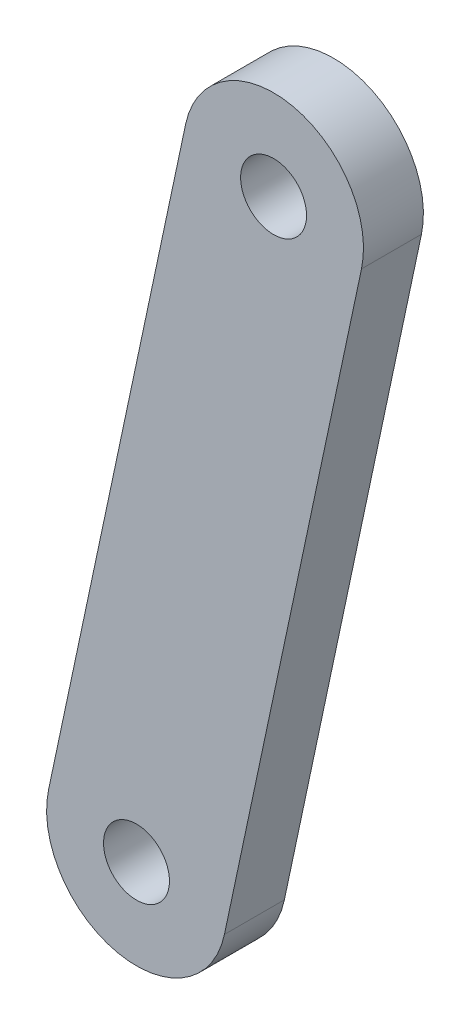
ISO-10303-21;
HEADER;
FILE_DESCRIPTION(('STEP AP214'),'2;1');
FILE_NAME('part.step','',(''),(''),'','','');
FILE_SCHEMA(('AUTOMOTIVE_DESIGN { 1 0 10303 214 1 1 1 1 }'));
ENDSEC;
DATA;
#1=APPLICATION_CONTEXT('core data for automotive mechanical design processes');
#2=APPLICATION_PROTOCOL_DEFINITION('international standard','automotive_design',2000,#1);
#3=PRODUCT_CONTEXT('',#1,'mechanical');
#4=PRODUCT('Part','Part','',(#3));
#5=PRODUCT_RELATED_PRODUCT_CATEGORY('part','',(#4));
#6=PRODUCT_DEFINITION_FORMATION('','',#4);
#7=PRODUCT_DEFINITION_CONTEXT('part definition',#1,'design');
#8=PRODUCT_DEFINITION('design','',#6,#7);
#9=PRODUCT_DEFINITION_SHAPE('','',#8);
#10=(LENGTH_UNIT() NAMED_UNIT(*) SI_UNIT(.MILLI.,.METRE.));
#11=(NAMED_UNIT(*) PLANE_ANGLE_UNIT() SI_UNIT($,.RADIAN.));
#12=(NAMED_UNIT(*) SI_UNIT($,.STERADIAN.) SOLID_ANGLE_UNIT());
#13=UNCERTAINTY_MEASURE_WITH_UNIT(LENGTH_MEASURE(1.E-05),#10,'distance_accuracy_value','');
#14=(GEOMETRIC_REPRESENTATION_CONTEXT(3) GLOBAL_UNCERTAINTY_ASSIGNED_CONTEXT((#13)) GLOBAL_UNIT_ASSIGNED_CONTEXT((#10,
#11,#12)) REPRESENTATION_CONTEXT('',''));
#15=CARTESIAN_POINT('',(0.,0.,0.));
#16=DIRECTION('',(0.,0.,1.));
#17=DIRECTION('',(1.,0.,0.));
#18=AXIS2_PLACEMENT_3D('',#15,#16,#17);
#19=CARTESIAN_POINT('',(12.861085,54.27887,0.));
#20=DIRECTION('',(0.,0.,-1.));
#21=DIRECTION('',(-1.,0.,0.));
#22=AXIS2_PLACEMENT_3D('',#19,#20,#21);
#23=PLANE('',#22);
#24=CARTESIAN_POINT('',(14.51109,54.27887,0.));
#25=CARTESIAN_POINT('',(14.5110921080409,54.3060802353696,0.));
#26=CARTESIAN_POINT('',(14.5104415402772,54.333291840744,0.));
#27=CARTESIAN_POINT('',(14.50782272471,54.3874598152676,0.));
#28=CARTESIAN_POINT('',(14.5058637612656,54.4144166349674,0.));
#29=CARTESIAN_POINT('',(14.5006286539221,54.4680753767878,0.));
#30=CARTESIAN_POINT('',(14.49735870856,54.4947779013919,0.));
#31=CARTESIAN_POINT('',(14.4895054906095,54.5479277493938,0.));
#32=CARTESIAN_POINT('',(14.4849251925286,54.5743755121144,0.));
#33=CARTESIAN_POINT('',(14.47445433338,54.6270161016901,0.));
#34=CARTESIAN_POINT('',(14.4685635000865,54.6532088743968,0.));
#35=CARTESIAN_POINT('',(14.4554750030221,54.7053400584337,0.));
#36=CARTESIAN_POINT('',(14.4482738906566,54.7312776034751,0.));
#37=CARTESIAN_POINT('',(14.4325675341173,54.7828990771646,0.));
#38=CARTESIAN_POINT('',(14.4240558248945,54.8085810371954,0.));
#39=CARTESIAN_POINT('',(14.405732936689,54.859692979166,0.));
#40=CARTESIAN_POINT('',(14.3959125335639,54.8851196500545,0.));
#41=CARTESIAN_POINT('',(14.375091736709,54.9354229762825,0.));
#42=CARTESIAN_POINT('',(14.3640938558593,54.9603006714701,0.));
#43=CARTESIAN_POINT('',(14.3409711918479,55.009319488043,0.));
#44=CARTESIAN_POINT('',(14.328854631398,55.0334644837242,0.));
#45=CARTESIAN_POINT('',(14.3034992337847,55.0810191997632,0.));
#46=CARTESIAN_POINT('',(14.2902656683342,55.1044317298622,0.));
#47=CARTESIAN_POINT('',(14.2626788184445,55.1505225234476,0.));
#48=CARTESIAN_POINT('',(14.2483278857207,55.1732021941578,0.));
#49=CARTESIAN_POINT('',(14.2185093330199,55.2178287549979,0.));
#50=CARTESIAN_POINT('',(14.2030412514771,55.2397753367014,0.));
#51=CARTESIAN_POINT('',(14.1709912902967,55.2829375836223,0.));
#52=CARTESIAN_POINT('',(14.1544063295472,55.3041509603676,0.));
#53=CARTESIAN_POINT('',(14.1201247638895,55.3458484679112,0.));
#54=CARTESIAN_POINT('',(14.1024227224448,55.3663281269145,0.));
#55=CARTESIAN_POINT('',(14.0659109180076,55.4065617584885,0.));
#56=CARTESIAN_POINT('',(14.0470936998334,55.4263089598142,0.));
#57=CARTESIAN_POINT('',(14.0085930508119,55.4648290179611,0.));
#58=CARTESIAN_POINT('',(13.9889122128382,55.4836044658503,0.));
#59=CARTESIAN_POINT('',(13.9487910846413,55.5200434038869,0.));
#60=CARTESIAN_POINT('',(13.9283569099781,55.53771362151,0.));
#61=CARTESIAN_POINT('',(13.8867331440742,55.571945328606,0.));
#62=CARTESIAN_POINT('',(13.8655473477777,55.5885114310956,0.));
#63=CARTESIAN_POINT('',(13.8224222469937,55.620536749831,0.));
#64=CARTESIAN_POINT('',(13.8004845767163,55.6359981661742,0.));
#65=CARTESIAN_POINT('',(13.7558579784911,55.6658166640198,0.));
#66=CARTESIAN_POINT('',(13.7331687421434,55.6801732839416,0.));
#67=CARTESIAN_POINT('',(13.6870409627872,55.7077850118955,0.));
#68=CARTESIAN_POINT('',(13.6636004489599,55.7210368265617,0.));
#69=CARTESIAN_POINT('',(13.6159714666375,55.7464413129641,0.));
#70=CARTESIAN_POINT('',(13.5917796867209,55.7585877728293,0.));
#71=CARTESIAN_POINT('',(13.5426504337225,55.7817863389592,0.));
#72=CARTESIAN_POINT('',(13.5177086641935,55.7928293364341,0.));
#73=CARTESIAN_POINT('',(13.4673977144958,55.8136836692198,0.));
#74=CARTESIAN_POINT('',(13.4420299382711,55.8234983906153,0.));
#75=CARTESIAN_POINT('',(13.3910182712322,55.8418098886083,0.));
#76=CARTESIAN_POINT('',(13.3653774559653,55.8503152209066,0.));
#77=CARTESIAN_POINT('',(13.3138222034126,55.8660124688508,0.));
#78=CARTESIAN_POINT('',(13.2879095068729,55.8732100986306,0.));
#79=CARTESIAN_POINT('',(13.2358115500251,55.8862943735436,0.));
#80=CARTESIAN_POINT('',(13.2096269575893,55.8921836766868,0.));
#81=CARTESIAN_POINT('',(13.1569863117798,55.9026545167529,0.));
#82=CARTESIAN_POINT('',(13.130530150121,55.9072355092114,0.));
#83=CARTESIAN_POINT('',(13.0773470880667,55.9150930825938,0.));
#84=CARTESIAN_POINT('',(13.0506196271886,55.9183658666447,0.));
#85=CARTESIAN_POINT('',(12.9968943092127,55.9236097292304,0.));
#86=CARTESIAN_POINT('',(12.9698957699404,55.9255738015188,0.));
#87=CARTESIAN_POINT('',(12.9156285517352,55.9282055307826,0.));
#88=CARTESIAN_POINT('',(12.8883593891855,55.9288631281545,0.));
#89=CARTESIAN_POINT('',(12.8338975248484,55.9288768524633,0.));
#90=CARTESIAN_POINT('',(12.8067048243377,55.9282366450006,0.));
#91=CARTESIAN_POINT('',(12.7525686823373,55.9256329433726,0.));
#92=CARTESIAN_POINT('',(12.725624808158,55.9236785306052,0.));
#93=CARTESIAN_POINT('',(12.671986888809,55.9184515556941,0.));
#94=CARTESIAN_POINT('',(12.6452922651747,55.9151849388765,0.));
#95=CARTESIAN_POINT('',(12.5921528939236,55.9073362077206,0.));
#96=CARTESIAN_POINT('',(12.565707746164,55.9027568046469,0.));
#97=CARTESIAN_POINT('',(12.5130671139061,55.8922858964519,0.));
#98=CARTESIAN_POINT('',(12.4868717377232,55.8863938468721,0.));
#99=CARTESIAN_POINT('',(12.4347300320629,55.8733010213648,0.));
#100=CARTESIAN_POINT('',(12.4087846377677,55.8660965230965,0.));
#101=CARTESIAN_POINT('',(12.357142176779,55.850381431323,0.));
#102=CARTESIAN_POINT('',(12.331447161013,55.8418641038332,0.));
#103=CARTESIAN_POINT('',(12.2803036696392,55.8235283393077,0.));
#104=CARTESIAN_POINT('',(12.2548585968715,55.8137004233381,0.));
#105=CARTESIAN_POINT('',(12.2045371430426,55.7928714497688,0.));
#106=CARTESIAN_POINT('',(12.1796593603964,55.7818737792309,0.));
#107=CARTESIAN_POINT('',(12.1306404803091,55.7587512679525,0.));
#108=CARTESIAN_POINT('',(12.1064955078144,55.7466346517465,0.));
#109=CARTESIAN_POINT('',(12.0589408086613,55.721279213528,0.));
#110=CARTESIAN_POINT('',(12.0355282723935,55.7080456629117,0.));
#111=CARTESIAN_POINT('',(11.9894374743025,55.6804588238565,0.));
#112=CARTESIAN_POINT('',(11.9667578052396,55.6661078871716,0.));
#113=CARTESIAN_POINT('',(11.9221312456062,55.6362893315691,0.));
#114=CARTESIAN_POINT('',(11.9001846634612,55.620821251088,0.));
#115=CARTESIAN_POINT('',(11.8570224162159,55.5887712906876,0.));
#116=CARTESIAN_POINT('',(11.8358090395893,55.5721863296524,0.));
#117=CARTESIAN_POINT('',(11.7941115321331,55.5379047637843,0.));
#118=CARTESIAN_POINT('',(11.7736318730977,55.5202027224166,0.));
#119=CARTESIAN_POINT('',(11.7333982414998,55.4836909180363,0.));
#120=CARTESIAN_POINT('',(11.7136510401827,55.4648736998411,0.));
#121=CARTESIAN_POINT('',(11.675130982042,55.4263730508042,0.));
#122=CARTESIAN_POINT('',(11.6563555341504,55.4066922128362,0.));
#123=CARTESIAN_POINT('',(11.619916596112,55.3665710846433,0.));
#124=CARTESIAN_POINT('',(11.6022463784895,55.3461369099786,0.));
#125=CARTESIAN_POINT('',(11.5680146713938,55.3045131440735,0.));
#126=CARTESIAN_POINT('',(11.551448568904,55.2833273477774,0.));
#127=CARTESIAN_POINT('',(11.5194232501684,55.2402022469937,0.));
#128=CARTESIAN_POINT('',(11.5039618338253,55.2182645767162,0.));
#129=CARTESIAN_POINT('',(11.4741433359797,55.1736379784909,0.));
#130=CARTESIAN_POINT('',(11.459786716058,55.1509487421432,0.));
#131=CARTESIAN_POINT('',(11.4321749881041,55.104820962787,0.));
#132=CARTESIAN_POINT('',(11.4189231734379,55.0813804489597,0.));
#133=CARTESIAN_POINT('',(11.3935186870356,55.0337514666373,0.));
#134=CARTESIAN_POINT('',(11.3813722271704,55.0095596867208,0.));
#135=CARTESIAN_POINT('',(11.3581736610407,54.9604304337224,0.));
#136=CARTESIAN_POINT('',(11.3471306635659,54.9354886641935,0.));
#137=CARTESIAN_POINT('',(11.3262763307803,54.8851777144959,0.));
#138=CARTESIAN_POINT('',(11.3164616093849,54.8598099382712,0.));
#139=CARTESIAN_POINT('',(11.298150111392,54.8087982712324,0.));
#140=CARTESIAN_POINT('',(11.2896447790938,54.7831574559656,0.));
#141=CARTESIAN_POINT('',(11.2739475311497,54.7316022034129,0.));
#142=CARTESIAN_POINT('',(11.2667499013699,54.7056895068732,0.));
#143=CARTESIAN_POINT('',(11.2536656264569,54.6535915500254,0.));
#144=CARTESIAN_POINT('',(11.2477763233138,54.6274069575897,0.));
#145=CARTESIAN_POINT('',(11.2373054832476,54.5747663117802,0.));
#146=CARTESIAN_POINT('',(11.2327244907891,54.5483101501214,0.));
#147=CARTESIAN_POINT('',(11.2248669174067,54.4951270880671,0.));
#148=CARTESIAN_POINT('',(11.2215941333558,54.4683996271889,0.));
#149=CARTESIAN_POINT('',(11.2163502707699,54.4146743092129,0.));
#150=CARTESIAN_POINT('',(11.2143861984815,54.3876757699406,0.));
#151=CARTESIAN_POINT('',(11.2117544692175,54.3334085517353,0.));
#152=CARTESIAN_POINT('',(11.2110968718456,54.3061393891855,0.));
#153=CARTESIAN_POINT('',(11.2110831475366,54.2516775248486,0.));
#154=CARTESIAN_POINT('',(11.2117233549993,54.224484824338,0.));
#155=CARTESIAN_POINT('',(11.2143270566271,54.1703486823379,0.));
#156=CARTESIAN_POINT('',(11.2162814693945,54.1434048081586,0.));
#157=CARTESIAN_POINT('',(11.2215084443055,54.0897668888098,0.));
#158=CARTESIAN_POINT('',(11.224775061123,54.0630722651756,0.));
#159=CARTESIAN_POINT('',(11.2326237922789,54.0099328939246,0.));
#160=CARTESIAN_POINT('',(11.2372031953525,53.983487746165,0.));
#161=CARTESIAN_POINT('',(11.2476741035475,53.9308471139071,0.));
#162=CARTESIAN_POINT('',(11.2535661531273,53.9046517377242,0.));
#163=CARTESIAN_POINT('',(11.2666589786347,53.8525100320638,0.));
#164=CARTESIAN_POINT('',(11.273863476903,53.8265646377685,0.));
#165=CARTESIAN_POINT('',(11.2895785686766,53.7749221767797,0.));
#166=CARTESIAN_POINT('',(11.2980958961665,53.7492271610135,0.));
#167=CARTESIAN_POINT('',(11.3164316606922,53.6980836696395,0.));
#168=CARTESIAN_POINT('',(11.3262595766618,53.6726385968716,0.));
#169=CARTESIAN_POINT('',(11.3470885502312,53.6223171430425,0.));
#170=CARTESIAN_POINT('',(11.3580862207692,53.5974393603962,0.));
#171=CARTESIAN_POINT('',(11.3812087320477,53.5484204803087,0.));
#172=CARTESIAN_POINT('',(11.3933253482537,53.5242755078139,0.));
#173=CARTESIAN_POINT('',(11.4186807864724,53.4767208086607,0.));
#174=CARTESIAN_POINT('',(11.4319143370886,53.4533082723929,0.));
#175=CARTESIAN_POINT('',(11.4595011761438,53.4072174743019,0.));
#176=CARTESIAN_POINT('',(11.4738521128288,53.384537805239,0.));
#177=CARTESIAN_POINT('',(11.5036706684312,53.3399112456055,0.));
#178=CARTESIAN_POINT('',(11.5191387489123,53.3179646634605,0.));
#179=CARTESIAN_POINT('',(11.5511887093128,53.2748024162153,0.));
#180=CARTESIAN_POINT('',(11.5677736703479,53.2535890395888,0.));
#181=CARTESIAN_POINT('',(11.602055236216,53.2118915321327,0.));
#182=CARTESIAN_POINT('',(11.6197572775836,53.1914118730973,0.));
#183=CARTESIAN_POINT('',(11.6562690819638,53.1511782414996,0.));
#184=CARTESIAN_POINT('',(11.675086300159,53.1314310401826,0.));
#185=CARTESIAN_POINT('',(11.713586949196,53.0929109820418,0.));
#186=CARTESIAN_POINT('',(11.7332677871643,53.07413553415,0.));
#187=CARTESIAN_POINT('',(11.7733889153575,53.0376965961114,0.));
#188=CARTESIAN_POINT('',(11.7938230900224,53.0200263784887,0.));
#189=CARTESIAN_POINT('',(11.8354468559277,52.9857946713928,0.));
#190=CARTESIAN_POINT('',(11.8566326522239,52.969228568903,0.));
#191=CARTESIAN_POINT('',(11.8997577530077,52.9372032501673,0.));
#192=CARTESIAN_POINT('',(11.9216954232852,52.9217418338242,0.));
#193=CARTESIAN_POINT('',(11.9663220215106,52.8919233359786,0.));
#194=CARTESIAN_POINT('',(11.9890112578582,52.8775667160568,0.));
#195=CARTESIAN_POINT('',(12.0351390372142,52.849954988103,0.));
#196=CARTESIAN_POINT('',(12.0585795510415,52.8367031734369,0.));
#197=CARTESIAN_POINT('',(12.1062085333636,52.8112986870349,0.));
#198=CARTESIAN_POINT('',(12.13040031328,52.7991522271698,0.));
#199=CARTESIAN_POINT('',(12.179529566278,52.7759536610403,0.));
#200=CARTESIAN_POINT('',(12.2044713358067,52.7649106635657,0.));
#201=CARTESIAN_POINT('',(12.2547822855045,52.7440563307802,0.));
#202=CARTESIAN_POINT('',(12.2801500617296,52.7342416093847,0.));
#203=CARTESIAN_POINT('',(12.3311617287691,52.7159301113917,0.));
#204=CARTESIAN_POINT('',(12.3568025440362,52.7074247790934,0.));
#205=CARTESIAN_POINT('',(12.4083577965894,52.6917275311492,0.));
#206=CARTESIAN_POINT('',(12.4342704931292,52.6845299013694,0.));
#207=CARTESIAN_POINT('',(12.4863684499772,52.6714456264564,0.));
#208=CARTESIAN_POINT('',(12.512553042413,52.6655563233132,0.));
#209=CARTESIAN_POINT('',(12.5651936882225,52.6550854832471,0.));
#210=CARTESIAN_POINT('',(12.5916498498812,52.6505044907886,0.));
#211=CARTESIAN_POINT('',(12.6448329119353,52.6426469174062,0.));
#212=CARTESIAN_POINT('',(12.6715603728133,52.6393741333553,0.));
#213=CARTESIAN_POINT('',(12.7252856907888,52.6341302707696,0.));
#214=CARTESIAN_POINT('',(12.7522842300608,52.6321661984812,0.));
#215=CARTESIAN_POINT('',(12.8065514482655,52.6295344692174,0.));
#216=CARTESIAN_POINT('',(12.8338206108149,52.6288768718455,0.));
#217=CARTESIAN_POINT('',(12.8882824751516,52.6288631475367,0.));
#218=CARTESIAN_POINT('',(12.9154751756622,52.6295033549994,0.));
#219=CARTESIAN_POINT('',(12.9696113176625,52.6321070566274,0.));
#220=CARTESIAN_POINT('',(12.9965551918419,52.6340614693948,0.));
#221=CARTESIAN_POINT('',(13.0501931111908,52.6392884443059,0.));
#222=CARTESIAN_POINT('',(13.076887734825,52.6425550611235,0.));
#223=CARTESIAN_POINT('',(13.1300271060762,52.6504037922794,0.));
#224=CARTESIAN_POINT('',(13.1564722538358,52.6549831953531,0.));
#225=CARTESIAN_POINT('',(13.2091128860936,52.6654541035481,0.));
#226=CARTESIAN_POINT('',(13.2353082622766,52.6713461531278,0.));
#227=CARTESIAN_POINT('',(13.2874499679368,52.6844389786352,0.));
#228=CARTESIAN_POINT('',(13.3133953622321,52.6916434769035,0.));
#229=CARTESIAN_POINT('',(13.3650378232208,52.707358568677,0.));
#230=CARTESIAN_POINT('',(13.3907328389869,52.7158758961668,0.));
#231=CARTESIAN_POINT('',(13.4418763303607,52.7342116606923,0.));
#232=CARTESIAN_POINT('',(13.4673214031285,52.7440395766619,0.));
#233=CARTESIAN_POINT('',(13.5176428569574,52.7648685502312,0.));
#234=CARTESIAN_POINT('',(13.5425206396036,52.7758662207691,0.));
#235=CARTESIAN_POINT('',(13.5915395196908,52.7989887320474,0.));
#236=CARTESIAN_POINT('',(13.6156844921855,52.8111053482533,0.));
#237=CARTESIAN_POINT('',(13.6632391913386,52.8364607864719,0.));
#238=CARTESIAN_POINT('',(13.6866517276064,52.8496943370881,0.));
#239=CARTESIAN_POINT('',(13.7327425256973,52.8772811761433,0.));
#240=CARTESIAN_POINT('',(13.7554221947602,52.8916321128282,0.));
#241=CARTESIAN_POINT('',(13.8000487543937,52.9214506684307,0.));
#242=CARTESIAN_POINT('',(13.8219953365388,52.9369187489117,0.));
#243=CARTESIAN_POINT('',(13.8651575837838,52.9689687093123,0.));
#244=CARTESIAN_POINT('',(13.88637096041,52.9855536703476,0.));
#245=CARTESIAN_POINT('',(13.9280684678673,53.0198352362154,0.));
#246=CARTESIAN_POINT('',(13.9485481269043,53.0375372775824,0.));
#247=CARTESIAN_POINT('',(13.9887817584981,53.0740490819645,0.));
#248=CARTESIAN_POINT('',(14.0085289598096,53.0928663001621,0.));
#249=CARTESIAN_POINT('',(14.0470490179656,53.1313669491925,0.));
#250=CARTESIAN_POINT('',(14.0658244658782,53.1510477871518,0.));
#251=CARTESIAN_POINT('',(14.1022634038594,53.1911689153684,0.));
#252=CARTESIAN_POINT('',(14.1199336214045,53.2116030900654,0.));
#253=CARTESIAN_POINT('',(14.1541653287113,53.2532268558823,0.));
#254=CARTESIAN_POINT('',(14.170731431488,53.2744126520588,0.));
#255=CARTESIAN_POINT('',(14.2027567494398,53.3175377531693,0.));
#256=CARTESIAN_POINT('',(14.2182181647149,53.339475423892,0.));
#257=CARTESIAN_POINT('',(14.24803666548,53.3841020209001,0.));
#258=CARTESIAN_POINT('',(14.2623932893913,53.4067912555845,0.));
#259=CARTESIAN_POINT('',(14.2900050064304,53.4529190394913,0.));
#260=CARTESIAN_POINT('',(14.3032568061378,53.4763595595553,0.));
#261=CARTESIAN_POINT('',(14.3286613334968,53.523988524802,0.));
#262=CARTESIAN_POINT('',(14.3408078496544,53.548180281249,0.));
#263=CARTESIAN_POINT('',(14.364006261545,53.5973095985532,0.));
#264=CARTESIAN_POINT('',(14.3750490464383,53.6222514567123,0.));
#265=CARTESIAN_POINT('',(14.3959115827416,53.6725805580231,0.));
#266=CARTESIAN_POINT('',(14.4057338425005,53.697966761164,0.));
#267=CARTESIAN_POINT('',(14.424058259203,53.7490100221604,0.));
#268=CARTESIAN_POINT('',(14.4325692292494,53.774663911622,0.));
#269=CARTESIAN_POINT('',(14.4482752374513,53.8262401796634,0.));
#270=CARTESIAN_POINT('',(14.4554762598627,53.8521607348492,0.));
#271=CARTESIAN_POINT('',(14.4685648884679,53.9042692326708,0.));
#272=CARTESIAN_POINT('',(14.4744554271134,53.9304564383455,0.));
#273=CARTESIAN_POINT('',(14.4849262739472,53.9830971105401,0.));
#274=CARTESIAN_POINT('',(14.4895063098834,54.0095506312061,0.));
#275=CARTESIAN_POINT('',(14.4973595407412,54.0627232634904,0.));
#276=CARTESIAN_POINT('',(14.5006292018539,54.0894428967605,0.));
#277=CARTESIAN_POINT('',(14.5058643113064,54.143147132093,0.));
#278=CARTESIAN_POINT('',(14.5078230005145,54.1701323903829,0.));
#279=CARTESIAN_POINT('',(14.5104418043506,54.2243686004085,0.));
#280=CARTESIAN_POINT('',(14.5110920872257,54.2516200287767,0.));
#281=CARTESIAN_POINT('',(14.51109,54.27887,0.));
#282=B_SPLINE_CURVE_WITH_KNOTS('',3,(#24,#25,#26,#27,#28,#29,#30,#31,#32,#33,#34,#35,#36,#37,
#38,#39,#40,#41,#42,#43,#44,#45,#46,#47,#48,#49,#50,#51,#52,#53,#54,#55,#56,#57,#58,#59,#60,#61,
#62,#63,#64,#65,#66,#67,#68,#69,#70,#71,#72,#73,#74,#75,#76,#77,#78,#79,#80,#81,#82,#83,#84,#85,
#86,#87,#88,#89,#90,#91,#92,#93,#94,#95,#96,#97,#98,#99,#100,#101,#102,#103,#104,#105,#106,#107,
#108,#109,#110,#111,#112,#113,#114,#115,#116,#117,#118,#119,#120,#121,#122,#123,#124,#125,#126,
#127,#128,#129,#130,#131,#132,#133,#134,#135,#136,#137,#138,#139,#140,#141,#142,#143,#144,#145,
#146,#147,#148,#149,#150,#151,#152,#153,#154,#155,#156,#157,#158,#159,#160,#161,#162,#163,#164,
#165,#166,#167,#168,#169,#170,#171,#172,#173,#174,#175,#176,#177,#178,#179,#180,#181,#182,#183,
#184,#185,#186,#187,#188,#189,#190,#191,#192,#193,#194,#195,#196,#197,#198,#199,#200,#201,#202,
#203,#204,#205,#206,#207,#208,#209,#210,#211,#212,#213,#214,#215,#216,#217,#218,#219,#220,#221,
#222,#223,#224,#225,#226,#227,#228,#229,#230,#231,#232,#233,#234,#235,#236,#237,#238,#239,#240,
#241,#242,#243,#244,#245,#246,#247,#248,#249,#250,#251,#252,#253,#254,#255,#256,#257,#258,#259,
#260,#261,#262,#263,#264,#265,#266,#267,#268,#269,#270,#271,#272,#273,#274,#275,#276,#277,#278,
#279,#280,#281),.UNSPECIFIED.,.F.,.F.,(4,2,2,2,2,2,2,2,2,2,2,2,2,2,2,2,2,2,2,2,2,2,2,2,2,2,2,2,
2,2,2,2,2,2,2,2,2,2,2,2,2,2,2,2,2,2,2,2,2,2,2,2,2,2,2,2,2,2,2,2,2,2,2,2,2,2,2,2,2,2,2,2,2,2,2,2,
2,2,2,2,2,2,2,2,2,2,2,2,2,2,2,2,2,2,2,2,2,2,2,2,2,2,2,2,2,2,2,2,2,2,2,2,2,2,2,2,2,2,2,2,2,2,2,2,
2,2,2,2,4),(0.,0.0816248451824052,0.162676549521562,0.243349464346557,0.32384068486957,
0.404348640756264,0.485071638258024,0.56620640685405,0.647946702971925,0.729515907281233,
0.810527168171509,0.891175450631839,0.971658357574624,1.0521747095133,1.13292307991453,
1.21410033959228,1.29590026274941,1.37746946705828,1.45848072794824,1.53912901040839,
1.61961191735112,1.70012826928985,1.78087663969125,1.86205389936927,1.94385382252676,
2.02542302683584,2.10643428772594,2.18708257018617,2.26756547712892,2.34808182906763,
2.42883019946898,2.51000745914691,2.59180738230431,2.67337658661362,2.75438784750391,
2.83503612996425,2.91551903690704,2.99603538884571,3.07678375924692,3.15796101892462,
3.23976094208167,3.32133014639065,3.40234140728068,3.48298968974087,3.56347259668361,
3.64398894862233,3.72473731902371,3.80591457870169,3.88771450185915,3.96928370616821,
4.05029496705831,4.13094324951854,4.2114261564613,4.2919425084,4.37269087880133,
4.45386813847923,4.53566806163656,4.6172372659454,4.69824852683534,4.77889680929546,
4.85937971623819,4.93989606817693,5.02064443857836,5.10182169825643,5.183621621414,
5.26519082572284,5.3462020866128,5.42685036907293,5.50733327601566,5.58784962795439,
5.66859799835582,5.74977525803388,5.83157518119144,5.91314438550075,5.99415564639102,
6.07480392885135,6.15528683579414,6.23580318773281,6.31655155813405,6.3977288178118,
6.47952874096893,6.56109794527882,6.64210920616951,6.72275748863009,6.80324039557297,
6.88375674751156,6.96450511791253,7.04568237758985,7.12748230074638,7.20905150505642,
7.29006276594723,7.37071104840788,7.45119395535077,7.53171030728934,7.61245867769025,
7.69363593736745,7.77543586052382,7.85700506483302,7.93801632572322,8.01866460818351,
8.09914751512628,8.17966386706497,8.26041223746623,8.341589497144,8.42338942030116,
8.50495862461004,8.58596988549999,8.66661816796013,8.74710107490285,8.8276174268416,
8.90836579724302,8.98954305692108,9.07134298007866,9.15291218438754,9.2339234452775,
9.31457172773765,9.39505463468038,9.47557098661911,9.55631935702052,9.63749661669854,
9.71929653985605,9.80092547025816,9.88197929188238,9.96265298789664,10.0431443039793,
10.1236523297175,10.2043760310647,10.2855127873319,10.3672569858007),.UNSPECIFIED.);
#283=CARTESIAN_POINT('',(14.51109,54.27887,0.));
#284=VERTEX_POINT('',#283);
#285=EDGE_CURVE('E124',#284,#284,#282,.T.);
#286=ORIENTED_EDGE('',*,*,#285,.T.);
#287=EDGE_LOOP('',(#286));
#288=FACE_BOUND('',#287,.T.);
#289=CARTESIAN_POINT('',(12.861085,54.27887,0.));
#290=DIRECTION('',(0.,0.,1.));
#291=DIRECTION('',(-1.,0.,0.));
#292=AXIS2_PLACEMENT_3D('',#289,#290,#291);
#293=CIRCLE('',#292,4.50000023691388);
#294=CARTESIAN_POINT('',(17.26275,53.34327,0.));
#295=VERTEX_POINT('',#294);
#296=CARTESIAN_POINT('',(8.45942,55.21447,0.));
#297=VERTEX_POINT('',#296);
#298=EDGE_CURVE('E115',#295,#297,#293,.T.);
#299=ORIENTED_EDGE('',*,*,#298,.F.);
#300=DIRECTION('',(0.207911817755589,0.978147573752328,0.));
#301=VECTOR('',#300,1.);
#302=CARTESIAN_POINT('',(17.26275,53.34327,0.));
#303=LINE('',#302,#301);
#304=CARTESIAN_POINT('',(10.40166,21.0644,0.));
#305=VERTEX_POINT('',#304);
#306=EDGE_CURVE('E87',#305,#295,#303,.T.);
#307=ORIENTED_EDGE('',*,*,#306,.F.);
#308=CARTESIAN_POINT('',(6.,22.,0.));
#309=DIRECTION('',(0.,0.,1.));
#310=DIRECTION('',(-1.,0.,0.));
#311=AXIS2_PLACEMENT_3D('',#308,#309,#310);
#312=CIRCLE('',#311,4.49999534617537);
#313=CARTESIAN_POINT('',(1.59834,22.9356,0.));
#314=VERTEX_POINT('',#313);
#315=EDGE_CURVE('E83',#314,#305,#312,.T.);
#316=ORIENTED_EDGE('',*,*,#315,.F.);
#317=DIRECTION('',(-0.207911527824449,-0.978147635379089,0.));
#318=VECTOR('',#317,1.);
#319=CARTESIAN_POINT('',(1.59834,22.9356,0.));
#320=LINE('',#319,#318);
#321=EDGE_CURVE('E103',#297,#314,#320,.T.);
#322=ORIENTED_EDGE('',*,*,#321,.F.);
#323=EDGE_LOOP('',(#299,#307,#316,#322));
#324=FACE_BOUND('',#323,.T.);
#325=CARTESIAN_POINT('',(7.65,22.,0.));
#326=CARTESIAN_POINT('',(7.65000210804085,22.0272102353696,0.));
#327=CARTESIAN_POINT('',(7.64935154027722,22.0544218407441,0.));
#328=CARTESIAN_POINT('',(7.64673272470997,22.1085898152678,0.));
#329=CARTESIAN_POINT('',(7.64477376126562,22.1355466349676,0.));
#330=CARTESIAN_POINT('',(7.63953865392211,22.189205376788,0.));
#331=CARTESIAN_POINT('',(7.63626870856,22.2159079013922,0.));
#332=CARTESIAN_POINT('',(7.62841549060945,22.2690577493941,0.));
#333=CARTESIAN_POINT('',(7.62383519252857,22.2955055121147,0.));
#334=CARTESIAN_POINT('',(7.61336433338,22.3481461016904,0.));
#335=CARTESIAN_POINT('',(7.60747350008648,22.3743388743971,0.));
#336=CARTESIAN_POINT('',(7.59438500302211,22.4264700584339,0.));
#337=CARTESIAN_POINT('',(7.58718389065662,22.4524076034754,0.));
#338=CARTESIAN_POINT('',(7.57147753411732,22.5040290771648,0.));
#339=CARTESIAN_POINT('',(7.56296582489454,22.5297110371956,0.));
#340=CARTESIAN_POINT('',(7.54464293668901,22.5808229791661,0.));
#341=CARTESIAN_POINT('',(7.53482253356388,22.6062496500546,0.));
#342=CARTESIAN_POINT('',(7.51400173670909,22.6565529762823,0.));
#343=CARTESIAN_POINT('',(7.50300385585948,22.6814306714696,0.));
#344=CARTESIAN_POINT('',(7.4798811918482,22.7304494880421,0.));
#345=CARTESIAN_POINT('',(7.46776463139838,22.7545944837231,0.));
#346=CARTESIAN_POINT('',(7.44240923378515,22.8021491997619,0.));
#347=CARTESIAN_POINT('',(7.42917566833465,22.8255617298608,0.));
#348=CARTESIAN_POINT('',(7.40158881844497,22.8716525234461,0.));
#349=CARTESIAN_POINT('',(7.38723788572124,22.8943321941562,0.));
#350=CARTESIAN_POINT('',(7.35741933302038,22.9389587549963,0.));
#351=CARTESIAN_POINT('',(7.34195125147757,22.9609053366998,0.));
#352=CARTESIAN_POINT('',(7.30990129029715,23.0040675836209,0.));
#353=CARTESIAN_POINT('',(7.29331632954764,23.0252809603663,0.));
#354=CARTESIAN_POINT('',(7.25903476388987,23.0669784679101,0.));
#355=CARTESIAN_POINT('',(7.24133272244506,23.0874581269136,0.));
#356=CARTESIAN_POINT('',(7.20482091800776,23.127691758488,0.));
#357=CARTESIAN_POINT('',(7.18600369983347,23.147438959814,0.));
#358=CARTESIAN_POINT('',(7.14750305081201,23.1859590179611,0.));
#359=CARTESIAN_POINT('',(7.12782221283856,23.2047344658504,0.));
#360=CARTESIAN_POINT('',(7.08770108464191,23.2411734038869,0.));
#361=CARTESIAN_POINT('',(7.06726690997881,23.2588436215101,0.));
#362=CARTESIAN_POINT('',(7.02564314407505,23.2930753286061,0.));
#363=CARTESIAN_POINT('',(7.00445734777857,23.3096414310957,0.));
#364=CARTESIAN_POINT('',(6.9613322469947,23.3416667498311,0.));
#365=CARTESIAN_POINT('',(6.93939457671735,23.3571281661743,0.));
#366=CARTESIAN_POINT('',(6.8947679784921,23.3869466640199,0.));
#367=CARTESIAN_POINT('',(6.87207874214437,23.4013032839417,0.));
#368=CARTESIAN_POINT('',(6.82595096278808,23.4289150118956,0.));
#369=CARTESIAN_POINT('',(6.80251044896069,23.4421668265618,0.));
#370=CARTESIAN_POINT('',(6.75488146663811,23.4675713129641,0.));
#371=CARTESIAN_POINT('',(6.73068968672142,23.4797177728293,0.));
#372=CARTESIAN_POINT('',(6.68156043372278,23.5029163389592,0.));
#373=CARTESIAN_POINT('',(6.65661866419365,23.5139593364341,0.));
#374=CARTESIAN_POINT('',(6.60630771449582,23.5348136692197,0.));
#375=CARTESIAN_POINT('',(6.58093993827115,23.5446283906151,0.));
#376=CARTESIAN_POINT('',(6.5299282712323,23.562939888608,0.));
#377=CARTESIAN_POINT('',(6.50428745596541,23.5714452209062,0.));
#378=CARTESIAN_POINT('',(6.45273220341266,23.5871424688503,0.));
#379=CARTESIAN_POINT('',(6.42681950687301,23.5943400986301,0.));
#380=CARTESIAN_POINT('',(6.37472155002518,23.6074243735431,0.));
#381=CARTESIAN_POINT('',(6.34853695758943,23.6133136766862,0.));
#382=CARTESIAN_POINT('',(6.29589631177992,23.6237845167524,0.));
#383=CARTESIAN_POINT('',(6.26944015012116,23.6283655092109,0.));
#384=CARTESIAN_POINT('',(6.21625708806686,23.6362230825933,0.));
#385=CARTESIAN_POINT('',(6.18952962718871,23.6394958666442,0.));
#386=CARTESIAN_POINT('',(6.13580430921278,23.64473972923,0.));
#387=CARTESIAN_POINT('',(6.10880576994051,23.6467038015185,0.));
#388=CARTESIAN_POINT('',(6.05453855173522,23.6493355307825,0.));
#389=CARTESIAN_POINT('',(6.0272693891855,23.6499931281544,0.));
#390=CARTESIAN_POINT('',(5.97280752484861,23.6500068524634,0.));
#391=CARTESIAN_POINT('',(5.94561482433811,23.6493666450007,0.));
#392=CARTESIAN_POINT('',(5.89147868233813,23.6467629433729,0.));
#393=CARTESIAN_POINT('',(5.8645348081589,23.6448085306055,0.));
#394=CARTESIAN_POINT('',(5.81089688881014,23.6395815556945,0.));
#395=CARTESIAN_POINT('',(5.784202265176,23.636314938877,0.));
#396=CARTESIAN_POINT('',(5.73106289392498,23.6284662077211,0.));
#397=CARTESIAN_POINT('',(5.70461774616539,23.6238868046475,0.));
#398=CARTESIAN_POINT('',(5.65197711390755,23.6134158964525,0.));
#399=CARTESIAN_POINT('',(5.62578173772455,23.6075238468727,0.));
#400=CARTESIAN_POINT('',(5.57364003206418,23.5944310213653,0.));
#401=CARTESIAN_POINT('',(5.54769463776884,23.587226523097,0.));
#402=CARTESIAN_POINT('',(5.49605217677992,23.5715114313234,0.));
#403=CARTESIAN_POINT('',(5.47035716101376,23.5629941038335,0.));
#404=CARTESIAN_POINT('',(5.41921366963962,23.5446583393078,0.));
#405=CARTESIAN_POINT('',(5.39376859687171,23.5348304233382,0.));
#406=CARTESIAN_POINT('',(5.34344714304276,23.5140014497689,0.));
#407=CARTESIAN_POINT('',(5.31856936039667,23.503003779231,0.));
#408=CARTESIAN_POINT('',(5.26955048030964,23.4798812679528,0.));
#409=CARTESIAN_POINT('',(5.24540550781502,23.4677646517468,0.));
#410=CARTESIAN_POINT('',(5.19785080866209,23.4424092135283,0.));
#411=CARTESIAN_POINT('',(5.17443827239438,23.4291756629121,0.));
#412=CARTESIAN_POINT('',(5.12834747430351,23.401588823857,0.));
#413=CARTESIAN_POINT('',(5.10566780524062,23.3872378871721,0.));
#414=CARTESIAN_POINT('',(5.06104124560718,23.3574193315696,0.));
#415=CARTESIAN_POINT('',(5.03909466346214,23.3419512510885,0.));
#416=CARTESIAN_POINT('',(4.99593241621678,23.309901290688,0.));
#417=CARTESIAN_POINT('',(4.97471903959015,23.2933163296528,0.));
#418=CARTESIAN_POINT('',(4.93302153213377,23.2590347637846,0.));
#419=CARTESIAN_POINT('',(4.91254187309824,23.2413327224169,0.));
#420=CARTESIAN_POINT('',(4.87230824150012,23.2048209180364,0.));
#421=CARTESIAN_POINT('',(4.85256104018282,23.1860036998412,0.));
#422=CARTESIAN_POINT('',(4.81404098204208,23.1475030508043,0.));
#423=CARTESIAN_POINT('',(4.79526553415049,23.1278222128364,0.));
#424=CARTESIAN_POINT('',(4.75882659611224,23.0877010846438,0.));
#425=CARTESIAN_POINT('',(4.74115637848971,23.0672669099792,0.));
#426=CARTESIAN_POINT('',(4.70692467139412,23.0256431440743,0.));
#427=CARTESIAN_POINT('',(4.69035856890437,23.0044573477782,0.));
#428=CARTESIAN_POINT('',(4.65833325016881,22.9613322469946,0.));
#429=CARTESIAN_POINT('',(4.6428718338257,22.9393945767171,0.));
#430=CARTESIAN_POINT('',(4.6130533359801,22.8947679784918,0.));
#431=CARTESIAN_POINT('',(4.59869671605834,22.8720787421441,0.));
#432=CARTESIAN_POINT('',(4.57108498810441,22.8259509627878,0.));
#433=CARTESIAN_POINT('',(4.5578331734382,22.8025104489605,0.));
#434=CARTESIAN_POINT('',(4.53242868703588,22.7548814666379,0.));
#435=CARTESIAN_POINT('',(4.52028222717064,22.7306896867213,0.));
#436=CARTESIAN_POINT('',(4.49708366104077,22.6815604337227,0.));
#437=CARTESIAN_POINT('',(4.48604066356591,22.6566186641936,0.));
#438=CARTESIAN_POINT('',(4.46518633078027,22.6063077144959,0.));
#439=CARTESIAN_POINT('',(4.45537160938489,22.5809399382712,0.));
#440=CARTESIAN_POINT('',(4.43706011139203,22.5299282712324,0.));
#441=CARTESIAN_POINT('',(4.42855477909377,22.5042874559656,0.));
#442=CARTESIAN_POINT('',(4.41285753114967,22.4527322034129,0.));
#443=CARTESIAN_POINT('',(4.40565990136989,22.4268195068732,0.));
#444=CARTESIAN_POINT('',(4.39257562645692,22.3747215500254,0.));
#445=CARTESIAN_POINT('',(4.38668632331376,22.3485369575897,0.));
#446=CARTESIAN_POINT('',(4.37621548324761,22.2958963117802,0.));
#447=CARTESIAN_POINT('',(4.37163449078914,22.2694401501214,0.));
#448=CARTESIAN_POINT('',(4.36377691740666,22.2162570880671,0.));
#449=CARTESIAN_POINT('',(4.36050413335578,22.1895296271889,0.));
#450=CARTESIAN_POINT('',(4.35526027076995,22.1358043092129,0.));
#451=CARTESIAN_POINT('',(4.35329619848152,22.1088057699406,0.));
#452=CARTESIAN_POINT('',(4.35066446921754,22.0545385517353,0.));
#453=CARTESIAN_POINT('',(4.35000687184559,22.0272693891855,0.));
#454=CARTESIAN_POINT('',(4.34999314753663,21.9728075248486,0.));
#455=CARTESIAN_POINT('',(4.35063335499925,21.945614824338,0.));
#456=CARTESIAN_POINT('',(4.35323705662709,21.8914786823379,0.));
#457=CARTESIAN_POINT('',(4.35519146939448,21.8645348081586,0.));
#458=CARTESIAN_POINT('',(4.36041844430549,21.8108968888098,0.));
#459=CARTESIAN_POINT('',(4.36368506112298,21.7842022651756,0.));
#460=CARTESIAN_POINT('',(4.37153379227886,21.7310628939246,0.));
#461=CARTESIAN_POINT('',(4.37611319535253,21.704617746165,0.));
#462=CARTESIAN_POINT('',(4.38658410354752,21.6519771139071,0.));
#463=CARTESIAN_POINT('',(4.39247615312733,21.6257817377242,0.));
#464=CARTESIAN_POINT('',(4.40556897863468,21.5736400320638,0.));
#465=CARTESIAN_POINT('',(4.41277347690301,21.5476946377685,0.));
#466=CARTESIAN_POINT('',(4.42848856867661,21.4960521767797,0.));
#467=CARTESIAN_POINT('',(4.43700589616652,21.4703571610135,0.));
#468=CARTESIAN_POINT('',(4.45534166069215,21.4192136696395,0.));
#469=CARTESIAN_POINT('',(4.46516957666184,21.3937685968716,0.));
#470=CARTESIAN_POINT('',(4.48599855023114,21.3434471430428,0.));
#471=CARTESIAN_POINT('',(4.49699622076902,21.3185693603967,0.));
#472=CARTESIAN_POINT('',(4.52011873204725,21.2695504803097,0.));
#473=CARTESIAN_POINT('',(4.53223534825322,21.2454055078151,0.));
#474=CARTESIAN_POINT('',(4.55759078647173,21.1978508086622,0.));
#475=CARTESIAN_POINT('',(4.57082433708796,21.1744382723945,0.));
#476=CARTESIAN_POINT('',(4.59841117614311,21.1283474743037,0.));
#477=CARTESIAN_POINT('',(4.61276211282804,21.1056678052408,0.));
#478=CARTESIAN_POINT('',(4.64258066843049,21.0610412456074,0.));
#479=CARTESIAN_POINT('',(4.65804874891162,21.0390946634623,0.));
#480=CARTESIAN_POINT('',(4.69009870931211,20.9959324162169,0.));
#481=CARTESIAN_POINT('',(4.70668367034724,20.9747190395903,0.));
#482=CARTESIAN_POINT('',(4.74096523621546,20.9330215321339,0.));
#483=CARTESIAN_POINT('',(4.75866727758318,20.9125418730983,0.));
#484=CARTESIAN_POINT('',(4.79517908196359,20.8723082415002,0.));
#485=CARTESIAN_POINT('',(4.81399630015885,20.8525610401828,0.));
#486=CARTESIAN_POINT('',(4.85249694919547,20.8140409820422,0.));
#487=CARTESIAN_POINT('',(4.87217778716318,20.7952655341508,0.));
#488=CARTESIAN_POINT('',(4.91229891535551,20.7588265961128,0.));
#489=CARTESIAN_POINT('',(4.93273309001999,20.7411563784904,0.));
#490=CARTESIAN_POINT('',(4.97435685592467,20.706924671395,0.));
#491=CARTESIAN_POINT('',(4.99554265222068,20.6903585689053,0.));
#492=CARTESIAN_POINT('',(5.03866775300418,20.6583332501698,0.));
#493=CARTESIAN_POINT('',(5.06060542328162,20.6428718338267,0.));
#494=CARTESIAN_POINT('',(5.10523202150694,20.6130533359811,0.));
#495=CARTESIAN_POINT('',(5.12792125785467,20.5986967160593,0.));
#496=CARTESIAN_POINT('',(5.17404903721102,20.5710849881053,0.));
#497=CARTESIAN_POINT('',(5.19748955103848,20.5578331734391,0.));
#498=CARTESIAN_POINT('',(5.24511853336124,20.5324286870365,0.));
#499=CARTESIAN_POINT('',(5.26931031327804,20.5202822271712,0.));
#500=CARTESIAN_POINT('',(5.31843956627692,20.4970836610411,0.));
#501=CARTESIAN_POINT('',(5.3433813358062,20.4860406635661,0.));
#502=CARTESIAN_POINT('',(5.39369228550416,20.4651863307802,0.));
#503=CARTESIAN_POINT('',(5.41906006172881,20.4553716093847,0.));
#504=CARTESIAN_POINT('',(5.47007172876762,20.4370601113917,0.));
#505=CARTESIAN_POINT('',(5.4957125440345,20.4285547790934,0.));
#506=CARTESIAN_POINT('',(5.54726779658722,20.4128575311492,0.));
#507=CARTESIAN_POINT('',(5.57318049312687,20.4056599013694,0.));
#508=CARTESIAN_POINT('',(5.62527844997469,20.3925756264564,0.));
#509=CARTESIAN_POINT('',(5.65146304241043,20.3866863233132,0.));
#510=CARTESIAN_POINT('',(5.70410368821994,20.3762154832471,0.));
#511=CARTESIAN_POINT('',(5.7305598498787,20.3716344907886,0.));
#512=CARTESIAN_POINT('',(5.78374291193302,20.3637769174062,0.));
#513=CARTESIAN_POINT('',(5.81047037281118,20.3605041333553,0.));
#514=CARTESIAN_POINT('',(5.86419569078714,20.3552602707696,0.));
#515=CARTESIAN_POINT('',(5.89119423005941,20.3532961984812,0.));
#516=CARTESIAN_POINT('',(5.94546144826474,20.3506644692174,0.));
#517=CARTESIAN_POINT('',(5.97273061081448,20.3500068718455,0.));
#518=CARTESIAN_POINT('',(6.02719247515122,20.3499931475367,0.));
#519=CARTESIAN_POINT('',(6.05438517566155,20.3506333549994,0.));
#520=CARTESIAN_POINT('',(6.10852131766124,20.3532370566274,0.));
#521=CARTESIAN_POINT('',(6.13546519184034,20.3551914693948,0.));
#522=CARTESIAN_POINT('',(6.18910311118891,20.3604184443059,0.));
#523=CARTESIAN_POINT('',(6.21579773482297,20.3636850611235,0.));
#524=CARTESIAN_POINT('',(6.2689371060739,20.3715337922794,0.));
#525=CARTESIAN_POINT('',(6.29538225383346,20.3761131953531,0.));
#526=CARTESIAN_POINT('',(6.3480228860913,20.3865841035481,0.));
#527=CARTESIAN_POINT('',(6.37421826227432,20.3924761531279,0.));
#528=CARTESIAN_POINT('',(6.42635996793478,20.4055689786352,0.));
#529=CARTESIAN_POINT('',(6.4523053622302,20.4127734769035,0.));
#530=CARTESIAN_POINT('',(6.50394782321931,20.428488568677,0.));
#531=CARTESIAN_POINT('',(6.52964283898559,20.4370058961668,0.));
#532=CARTESIAN_POINT('',(6.58078633036003,20.4553416606923,0.));
#533=CARTESIAN_POINT('',(6.60623140312811,20.4651695766619,0.));
#534=CARTESIAN_POINT('',(6.65655285695715,20.4859985502309,0.));
#535=CARTESIAN_POINT('',(6.68143063960316,20.4969962207686,0.));
#536=CARTESIAN_POINT('',(6.73044951969004,20.5201187320465,0.));
#537=CARTESIAN_POINT('',(6.7545944921846,20.5322353482523,0.));
#538=CARTESIAN_POINT('',(6.80214919133743,20.5575907864706,0.));
#539=CARTESIAN_POINT('',(6.82556172760511,20.5708243370867,0.));
#540=CARTESIAN_POINT('',(6.87165252569591,20.5984111761418,0.));
#541=CARTESIAN_POINT('',(6.89433219475877,20.6127621128267,0.));
#542=CARTESIAN_POINT('',(6.93895875439228,20.6425806684291,0.));
#543=CARTESIAN_POINT('',(6.96090533653744,20.6580487489102,0.));
#544=CARTESIAN_POINT('',(7.00406758378256,20.690098709311,0.));
#545=CARTESIAN_POINT('',(7.02528096040883,20.7066836703463,0.));
#546=CARTESIAN_POINT('',(7.0669784678664,20.7409652362143,0.));
#547=CARTESIAN_POINT('',(7.08745812690348,20.7586672775816,0.));
#548=CARTESIAN_POINT('',(7.12769175849765,20.795179081964,0.));
#549=CARTESIAN_POINT('',(7.14743895980939,20.8139963001619,0.));
#550=CARTESIAN_POINT('',(7.18595901796571,20.8524969491927,0.));
#551=CARTESIAN_POINT('',(7.20473446587836,20.872177787152,0.));
#552=CARTESIAN_POINT('',(7.24117340385969,20.9122989153688,0.));
#553=CARTESIAN_POINT('',(7.25884362140491,20.9327330900659,0.));
#554=CARTESIAN_POINT('',(7.29307532871182,20.9743568558829,0.));
#555=CARTESIAN_POINT('',(7.30964143148854,20.9955426520595,0.));
#556=CARTESIAN_POINT('',(7.34166674944038,21.03866775317,0.));
#557=CARTESIAN_POINT('',(7.35712816471555,21.0606054238927,0.));
#558=CARTESIAN_POINT('',(7.38694666548064,21.1052320209009,0.));
#559=CARTESIAN_POINT('',(7.40130328939191,21.1279212555852,0.));
#560=CARTESIAN_POINT('',(7.42891500643094,21.174049039492,0.));
#561=CARTESIAN_POINT('',(7.44216680613827,21.1974895595559,0.));
#562=CARTESIAN_POINT('',(7.46757133349717,21.2451185248025,0.));
#563=CARTESIAN_POINT('',(7.47971784965472,21.2693102812494,0.));
#564=CARTESIAN_POINT('',(7.50291626154518,21.3184395985535,0.));
#565=CARTESIAN_POINT('',(7.51395904643834,21.3433814567124,0.));
#566=CARTESIAN_POINT('',(7.5348215827416,21.3937105580232,0.));
#567=CARTESIAN_POINT('',(7.54464384250047,21.4190967611642,0.));
#568=CARTESIAN_POINT('',(7.56296825920295,21.4701400221608,0.));
#569=CARTESIAN_POINT('',(7.57147922924944,21.4957939116225,0.));
#570=CARTESIAN_POINT('',(7.58718523745131,21.547370179664,0.));
#571=CARTESIAN_POINT('',(7.59438625986269,21.5732907348499,0.));
#572=CARTESIAN_POINT('',(7.6074748884679,21.6253992326715,0.));
#573=CARTESIAN_POINT('',(7.61336542711344,21.6515864383463,0.));
#574=CARTESIAN_POINT('',(7.62383627394724,21.7042271105409,0.));
#575=CARTESIAN_POINT('',(7.62841630988337,21.7306806312068,0.));
#576=CARTESIAN_POINT('',(7.63626954074122,21.783853263491,0.));
#577=CARTESIAN_POINT('',(7.63953920185392,21.8105728967611,0.));
#578=CARTESIAN_POINT('',(7.64477431130642,21.8642771320935,0.));
#579=CARTESIAN_POINT('',(7.64673300051454,21.8912623903833,0.));
#580=CARTESIAN_POINT('',(7.64935180435064,21.9454986004087,0.));
#581=CARTESIAN_POINT('',(7.65000208722567,21.9727500287769,0.));
#582=CARTESIAN_POINT('',(7.65,22.,0.));
#583=B_SPLINE_CURVE_WITH_KNOTS('',3,(#325,#326,#327,#328,#329,#330,#331,#332,#333,#334,#335,
#336,#337,#338,#339,#340,#341,#342,#343,#344,#345,#346,#347,#348,#349,#350,#351,#352,#353,#354,
#355,#356,#357,#358,#359,#360,#361,#362,#363,#364,#365,#366,#367,#368,#369,#370,#371,#372,#373,
#374,#375,#376,#377,#378,#379,#380,#381,#382,#383,#384,#385,#386,#387,#388,#389,#390,#391,#392,
#393,#394,#395,#396,#397,#398,#399,#400,#401,#402,#403,#404,#405,#406,#407,#408,#409,#410,#411,
#412,#413,#414,#415,#416,#417,#418,#419,#420,#421,#422,#423,#424,#425,#426,#427,#428,#429,#430,
#431,#432,#433,#434,#435,#436,#437,#438,#439,#440,#441,#442,#443,#444,#445,#446,#447,#448,#449,
#450,#451,#452,#453,#454,#455,#456,#457,#458,#459,#460,#461,#462,#463,#464,#465,#466,#467,#468,
#469,#470,#471,#472,#473,#474,#475,#476,#477,#478,#479,#480,#481,#482,#483,#484,#485,#486,#487,
#488,#489,#490,#491,#492,#493,#494,#495,#496,#497,#498,#499,#500,#501,#502,#503,#504,#505,#506,
#507,#508,#509,#510,#511,#512,#513,#514,#515,#516,#517,#518,#519,#520,#521,#522,#523,#524,#525,
#526,#527,#528,#529,#530,#531,#532,#533,#534,#535,#536,#537,#538,#539,#540,#541,#542,#543,#544,
#545,#546,#547,#548,#549,#550,#551,#552,#553,#554,#555,#556,#557,#558,#559,#560,#561,#562,#563,
#564,#565,#566,#567,#568,#569,#570,#571,#572,#573,#574,#575,#576,#577,#578,#579,#580,#581,#582),
.UNSPECIFIED.,.F.,.F.,(4,2,2,2,2,2,2,2,2,2,2,2,2,2,2,2,2,2,2,2,2,2,2,2,2,2,2,2,2,2,2,2,2,2,2,2,
2,2,2,2,2,2,2,2,2,2,2,2,2,2,2,2,2,2,2,2,2,2,2,2,2,2,2,2,2,2,2,2,2,2,2,2,2,2,2,2,2,2,2,2,2,2,2,2,
2,2,2,2,2,2,2,2,2,2,2,2,2,2,2,2,2,2,2,2,2,2,2,2,2,2,2,2,2,2,2,2,2,2,2,2,2,2,2,2,2,2,2,2,4),(0.,
0.0816248451825439,0.162676549521805,0.243349464346868,0.323840684869895,0.404348640756569,
0.485071638258269,0.566206406854202,0.647946702971942,0.729515907280508,0.810527168170257,
0.891175450630271,0.97165835757295,1.05217470951173,1.13292307991327,1.21410033959151,
1.29590026274931,1.37746946705787,1.45848072794761,1.53912901040761,1.61961191735029,
1.70012826928907,1.78087663969063,1.86205389936892,1.94385382252681,2.02542302683575,
2.10643428772576,2.18708257018594,2.26756547712867,2.3480818290674,2.42883019946878,
2.51000745914677,2.59180738230424,2.67337658661291,2.75438784750273,2.83503612996279,
2.91551903690549,2.99603538884425,3.07678375924575,3.15796101892393,3.23976094208166,
3.32133014639015,3.40234140727983,3.48298968973981,3.56347259668248,3.64398894862127,
3.72473731902285,3.80591457870117,3.88771450185909,3.96928370616775,4.05029496705755,
4.1309432495176,4.21142615646029,4.29194250839906,4.37269087880057,4.45386813847879,
4.53566806163655,4.6172372659454,4.69824852683533,4.77889680929546,4.85937971623818,
4.93989606817693,5.02064443857835,5.10182169825642,5.18362162141399,5.26519082572285,
5.34620208661279,5.42685036907293,5.50733327601565,5.58784962795439,5.66859799835582,
5.74977525803388,5.83157518119144,5.91314438549987,5.99415564638951,6.07480392884947,
6.15528683579213,6.23580318773094,6.31655155813253,6.39772881781087,6.47952874096882,
6.56109794527675,6.64210920616604,6.72275748862578,6.80324039556837,6.88375674750724,
6.96450511790906,7.04568237758778,7.12748230074625,7.20905150505522,7.29006276594525,
7.37071104840542,7.45119395534816,7.53171030728689,7.61245867768828,7.6936359373663,
7.77543586052382,7.85700506483199,7.93801632572145,8.01866460818131,8.09914751512394,
8.17966386706277,8.26041223746445,8.34158949714292,8.42338942030105,8.50495862460907,
8.58596988549841,8.66661816795817,8.74710107490076,8.82761742683963,8.90836579724145,
8.98954305692017,9.07134298007867,9.15291218438798,9.23392344527826,9.31457172773859,
9.39505463468138,9.47557098662006,9.55631935702128,9.637496616699,9.71929653985608,
9.8009254702585,9.88197929188295,9.96265298789734,10.0431443039801,10.1236523297182,
10.2043760310653,10.2855127873322,10.3672569858007),.UNSPECIFIED.);
#584=CARTESIAN_POINT('',(7.65,22.,0.));
#585=VERTEX_POINT('',#584);
#586=EDGE_CURVE('E113',#585,#585,#583,.T.);
#587=ORIENTED_EDGE('',*,*,#586,.T.);
#588=EDGE_LOOP('',(#587));
#589=FACE_BOUND('',#588,.T.);
#590=ADVANCED_FACE('F43',(#288,#324,#589),#23,.T.);
#591=CARTESIAN_POINT('',(12.861085,54.27887,3.));
#592=DIRECTION('',(0.,0.,-1.));
#593=DIRECTION('',(-1.,0.,0.));
#594=AXIS2_PLACEMENT_3D('',#591,#592,#593);
#595=CYLINDRICAL_SURFACE('',#594,4.50000023691388);
#596=ORIENTED_EDGE('',*,*,#298,.T.);
#597=DIRECTION('',(0.,0.,-1.));
#598=VECTOR('',#597,1.);
#599=CARTESIAN_POINT('',(8.45942,55.21447,3.));
#600=LINE('',#599,#598);
#601=CARTESIAN_POINT('',(8.45942,55.21447,3.));
#602=VERTEX_POINT('',#601);
#603=EDGE_CURVE('E11',#602,#297,#600,.T.);
#604=ORIENTED_EDGE('',*,*,#603,.F.);
#605=CARTESIAN_POINT('',(12.861085,54.27887,3.));
#606=DIRECTION('',(0.,0.,1.));
#607=DIRECTION('',(-1.,0.,0.));
#608=AXIS2_PLACEMENT_3D('',#605,#606,#607);
#609=CIRCLE('',#608,4.50000023691388);
#610=CARTESIAN_POINT('',(17.26275,53.34327,3.));
#611=VERTEX_POINT('',#610);
#612=EDGE_CURVE('E97',#611,#602,#609,.T.);
#613=ORIENTED_EDGE('',*,*,#612,.F.);
#614=DIRECTION('',(0.,0.,-1.));
#615=VECTOR('',#614,1.);
#616=CARTESIAN_POINT('',(17.26275,53.34327,3.));
#617=LINE('',#616,#615);
#618=EDGE_CURVE('E107',#611,#295,#617,.T.);
#619=ORIENTED_EDGE('',*,*,#618,.T.);
#620=EDGE_LOOP('',(#596,#604,#613,#619));
#621=FACE_BOUND('',#620,.T.);
#622=ADVANCED_FACE('F44',(#621),#595,.T.);
#623=CARTESIAN_POINT('',(1.59834,22.9356,3.));
#624=DIRECTION('',(0.978147635379089,-0.207911527824449,0.));
#625=DIRECTION('',(0.207911527824449,0.978147635379089,0.));
#626=AXIS2_PLACEMENT_3D('',#623,#624,#625);
#627=PLANE('',#626);
#628=ORIENTED_EDGE('',*,*,#321,.T.);
#629=DIRECTION('',(0.,0.,-1.));
#630=VECTOR('',#629,1.);
#631=CARTESIAN_POINT('',(1.59834,22.9356,3.));
#632=LINE('',#631,#630);
#633=CARTESIAN_POINT('',(1.59834,22.9356,3.));
#634=VERTEX_POINT('',#633);
#635=EDGE_CURVE('E54',#634,#314,#632,.T.);
#636=ORIENTED_EDGE('',*,*,#635,.F.);
#637=DIRECTION('',(-0.207911527824449,-0.978147635379089,0.));
#638=VECTOR('',#637,1.);
#639=CARTESIAN_POINT('',(1.59834,22.9356,3.));
#640=LINE('',#639,#638);
#641=EDGE_CURVE('E94',#602,#634,#640,.T.);
#642=ORIENTED_EDGE('',*,*,#641,.F.);
#643=ORIENTED_EDGE('',*,*,#603,.T.);
#644=EDGE_LOOP('',(#628,#636,#642,#643));
#645=FACE_BOUND('',#644,.T.);
#646=ADVANCED_FACE('F105',(#645),#627,.F.);
#647=CARTESIAN_POINT('',(6.,22.,3.));
#648=DIRECTION('',(0.,0.,-1.));
#649=DIRECTION('',(-1.,0.,0.));
#650=AXIS2_PLACEMENT_3D('',#647,#648,#649);
#651=CYLINDRICAL_SURFACE('',#650,4.49999534617537);
#652=ORIENTED_EDGE('',*,*,#315,.T.);
#653=DIRECTION('',(0.,0.,-1.));
#654=VECTOR('',#653,1.);
#655=CARTESIAN_POINT('',(10.40166,21.0644,3.));
#656=LINE('',#655,#654);
#657=CARTESIAN_POINT('',(10.40166,21.0644,3.));
#658=VERTEX_POINT('',#657);
#659=EDGE_CURVE('E102',#658,#305,#656,.T.);
#660=ORIENTED_EDGE('',*,*,#659,.F.);
#661=CARTESIAN_POINT('',(6.,22.,3.));
#662=DIRECTION('',(0.,0.,1.));
#663=DIRECTION('',(-1.,0.,0.));
#664=AXIS2_PLACEMENT_3D('',#661,#662,#663);
#665=CIRCLE('',#664,4.49999534617537);
#666=EDGE_CURVE('E100',#634,#658,#665,.T.);
#667=ORIENTED_EDGE('',*,*,#666,.F.);
#668=ORIENTED_EDGE('',*,*,#635,.T.);
#669=EDGE_LOOP('',(#652,#660,#667,#668));
#670=FACE_BOUND('',#669,.T.);
#671=ADVANCED_FACE('F106',(#670),#651,.T.);
#672=CARTESIAN_POINT('',(17.26275,53.34327,3.));
#673=DIRECTION('',(-0.978147573752328,0.207911817755589,0.));
#674=DIRECTION('',(-0.207911817755589,-0.978147573752328,0.));
#675=AXIS2_PLACEMENT_3D('',#672,#673,#674);
#676=PLANE('',#675);
#677=ORIENTED_EDGE('',*,*,#306,.T.);
#678=ORIENTED_EDGE('',*,*,#618,.F.);
#679=DIRECTION('',(0.207911817755589,0.978147573752328,0.));
#680=VECTOR('',#679,1.);
#681=CARTESIAN_POINT('',(17.26275,53.34327,3.));
#682=LINE('',#681,#680);
#683=EDGE_CURVE('E61',#658,#611,#682,.T.);
#684=ORIENTED_EDGE('',*,*,#683,.F.);
#685=ORIENTED_EDGE('',*,*,#659,.T.);
#686=EDGE_LOOP('',(#677,#678,#684,#685));
#687=FACE_BOUND('',#686,.T.);
#688=ADVANCED_FACE('F137',(#687),#676,.F.);
#689=CARTESIAN_POINT('',(12.861085,54.27887,3.));
#690=DIRECTION('',(0.,0.,-1.));
#691=DIRECTION('',(-1.,0.,0.));
#692=AXIS2_PLACEMENT_3D('',#689,#690,#691);
#693=PLANE('',#692);
#694=CARTESIAN_POINT('',(6.,22.,3.));
#695=DIRECTION('',(0.,0.,1.));
#696=DIRECTION('',(1.,0.,0.));
#697=AXIS2_PLACEMENT_3D('',#694,#695,#696);
#698=CIRCLE('',#697,1.65);
#699=CARTESIAN_POINT('',(7.65,22.,3.));
#700=VERTEX_POINT('',#699);
#701=EDGE_CURVE('E160',#700,#700,#698,.T.);
#702=ORIENTED_EDGE('',*,*,#701,.F.);
#703=EDGE_LOOP('',(#702));
#704=FACE_BOUND('',#703,.T.);
#705=CARTESIAN_POINT('',(12.86109,54.27887,3.));
#706=DIRECTION('',(0.,0.,1.));
#707=DIRECTION('',(1.,0.,0.));
#708=AXIS2_PLACEMENT_3D('',#705,#706,#707);
#709=CIRCLE('',#708,1.65);
#710=CARTESIAN_POINT('',(14.51109,54.27887,3.));
#711=VERTEX_POINT('',#710);
#712=EDGE_CURVE('E157',#711,#711,#709,.T.);
#713=ORIENTED_EDGE('',*,*,#712,.F.);
#714=EDGE_LOOP('',(#713));
#715=FACE_BOUND('',#714,.T.);
#716=ORIENTED_EDGE('',*,*,#612,.T.);
#717=ORIENTED_EDGE('',*,*,#641,.T.);
#718=ORIENTED_EDGE('',*,*,#666,.T.);
#719=ORIENTED_EDGE('',*,*,#683,.T.);
#720=EDGE_LOOP('',(#716,#717,#718,#719));
#721=FACE_BOUND('',#720,.T.);
#722=ADVANCED_FACE('F92',(#704,#715,#721),#693,.F.);
#723=CARTESIAN_POINT('',(12.86109,54.27887,-1.2E-05));
#724=DIRECTION('',(0.,0.,1.));
#725=DIRECTION('',(1.,0.,0.));
#726=AXIS2_PLACEMENT_3D('',#723,#724,#725);
#727=CYLINDRICAL_SURFACE('',#726,1.65);
#728=ORIENTED_EDGE('',*,*,#285,.F.);
#729=EDGE_LOOP('',(#728));
#730=FACE_BOUND('',#729,.T.);
#731=ORIENTED_EDGE('',*,*,#712,.T.);
#732=EDGE_LOOP('',(#731));
#733=FACE_BOUND('',#732,.T.);
#734=ADVANCED_FACE('F177',(#730,#733),#727,.F.);
#735=CARTESIAN_POINT('',(6.,22.,-1.2E-05));
#736=DIRECTION('',(0.,0.,1.));
#737=DIRECTION('',(1.,0.,0.));
#738=AXIS2_PLACEMENT_3D('',#735,#736,#737);
#739=CYLINDRICAL_SURFACE('',#738,1.65);
#740=ORIENTED_EDGE('',*,*,#586,.F.);
#741=EDGE_LOOP('',(#740));
#742=FACE_BOUND('',#741,.T.);
#743=ORIENTED_EDGE('',*,*,#701,.T.);
#744=EDGE_LOOP('',(#743));
#745=FACE_BOUND('',#744,.T.);
#746=ADVANCED_FACE('F172',(#742,#745),#739,.F.);
#747=CLOSED_SHELL('',(#590,#622,#646,#671,#688,#722,#734,#746));
#748=MANIFOLD_SOLID_BREP('B2',#747);
#749=ADVANCED_BREP_SHAPE_REPRESENTATION('',(#18,#748),#14);
#750=SHAPE_DEFINITION_REPRESENTATION(#9,#749);
ENDSEC;
END-ISO-10303-21;
